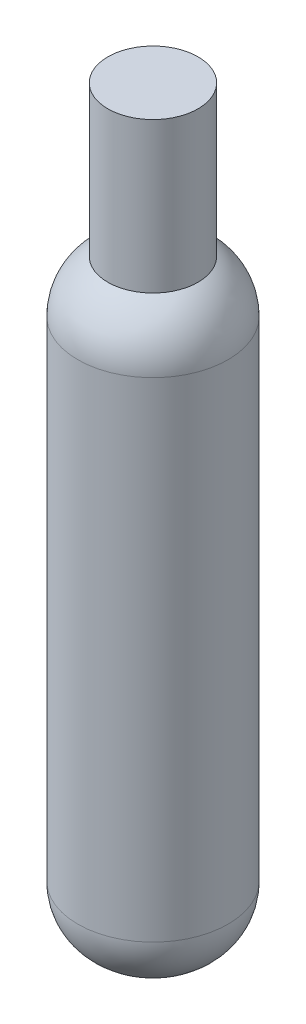
ISO-10303-21;
HEADER;
FILE_DESCRIPTION(('STEP AP214'),'2;1');
FILE_NAME('part.step','',(''),(''),'','','');
FILE_SCHEMA(('AUTOMOTIVE_DESIGN { 1 0 10303 214 1 1 1 1 }'));
ENDSEC;
DATA;
#1=APPLICATION_CONTEXT('core data for automotive mechanical design processes');
#2=APPLICATION_PROTOCOL_DEFINITION('international standard','automotive_design',2000,#1);
#3=PRODUCT_CONTEXT('',#1,'mechanical');
#4=PRODUCT('Part','Part','',(#3));
#5=PRODUCT_RELATED_PRODUCT_CATEGORY('part','',(#4));
#6=PRODUCT_DEFINITION_FORMATION('','',#4);
#7=PRODUCT_DEFINITION_CONTEXT('part definition',#1,'design');
#8=PRODUCT_DEFINITION('design','',#6,#7);
#9=PRODUCT_DEFINITION_SHAPE('','',#8);
#10=(LENGTH_UNIT() NAMED_UNIT(*) SI_UNIT(.MILLI.,.METRE.));
#11=(NAMED_UNIT(*) PLANE_ANGLE_UNIT() SI_UNIT($,.RADIAN.));
#12=(NAMED_UNIT(*) SI_UNIT($,.STERADIAN.) SOLID_ANGLE_UNIT());
#13=UNCERTAINTY_MEASURE_WITH_UNIT(LENGTH_MEASURE(1.E-05),#10,'distance_accuracy_value','');
#14=(GEOMETRIC_REPRESENTATION_CONTEXT(3) GLOBAL_UNCERTAINTY_ASSIGNED_CONTEXT((#13)) GLOBAL_UNIT_ASSIGNED_CONTEXT((#10,
#11,#12)) REPRESENTATION_CONTEXT('',''));
#15=CARTESIAN_POINT('',(0.,0.,0.));
#16=DIRECTION('',(0.,0.,1.));
#17=DIRECTION('',(1.,0.,0.));
#18=AXIS2_PLACEMENT_3D('',#15,#16,#17);
#19=CARTESIAN_POINT('',(0.,20.,0.));
#20=DIRECTION('',(0.,-1.,0.));
#21=DIRECTION('',(0.,0.,-1.));
#22=AXIS2_PLACEMENT_3D('',#19,#20,#21);
#23=CYLINDRICAL_SURFACE('',#22,2.5);
#24=CARTESIAN_POINT('',(0.,18.2679491924311,0.));
#25=DIRECTION('',(0.,1.,0.));
#26=DIRECTION('',(0.,0.,1.));
#27=AXIS2_PLACEMENT_3D('',#24,#25,#26);
#28=CIRCLE('',#27,2.5);
#29=CARTESIAN_POINT('',(0.,18.2679491924311,2.5));
#30=VERTEX_POINT('',#29);
#31=EDGE_CURVE('E10',#30,#30,#28,.F.);
#32=ORIENTED_EDGE('',*,*,#31,.T.);
#33=EDGE_LOOP('',(#32));
#34=FACE_BOUND('',#33,.T.);
#35=CARTESIAN_POINT('',(0.,2.,0.));
#36=DIRECTION('',(0.,1.,0.));
#37=DIRECTION('',(0.,0.,1.));
#38=AXIS2_PLACEMENT_3D('',#35,#36,#37);
#39=CIRCLE('',#38,2.5);
#40=CARTESIAN_POINT('',(0.,2.,2.5));
#41=VERTEX_POINT('',#40);
#42=EDGE_CURVE('E50',#41,#41,#39,.T.);
#43=ORIENTED_EDGE('',*,*,#42,.T.);
#44=EDGE_LOOP('',(#43));
#45=FACE_BOUND('',#44,.T.);
#46=ADVANCED_FACE('F37',(#34,#45),#23,.T.);
#47=CARTESIAN_POINT('',(0.,2.,0.));
#48=DIRECTION('',(0.,1.,0.));
#49=DIRECTION('',(0.,0.,1.));
#50=AXIS2_PLACEMENT_3D('',#47,#48,#49);
#51=DEGENERATE_TOROIDAL_SURFACE('',#50,0.5,2.,.T.);
#52=CARTESIAN_POINT('',(0.,0.267949192431121,0.));
#53=DIRECTION('',(0.,1.,0.));
#54=DIRECTION('',(0.,0.,1.));
#55=AXIS2_PLACEMENT_3D('',#52,#53,#54);
#56=CIRCLE('',#55,1.5);
#57=CARTESIAN_POINT('',(0.,0.267949192431121,1.5));
#58=VERTEX_POINT('',#57);
#59=EDGE_CURVE('E56',#58,#58,#56,.F.);
#60=ORIENTED_EDGE('',*,*,#59,.F.);
#61=EDGE_LOOP('',(#60));
#62=FACE_BOUND('',#61,.T.);
#63=ORIENTED_EDGE('',*,*,#42,.F.);
#64=EDGE_LOOP('',(#63));
#65=FACE_BOUND('',#64,.T.);
#66=ADVANCED_FACE('F71',(#62,#65),#51,.T.);
#67=CARTESIAN_POINT('',(0.,6.,0.));
#68=DIRECTION('',(0.,-1.,0.));
#69=DIRECTION('',(0.,0.,-1.));
#70=AXIS2_PLACEMENT_3D('',#67,#68,#69);
#71=CYLINDRICAL_SURFACE('',#70,1.5);
#72=ORIENTED_EDGE('',*,*,#59,.T.);
#73=EDGE_LOOP('',(#72));
#74=FACE_BOUND('',#73,.T.);
#75=CARTESIAN_POINT('',(0.,6.,0.));
#76=DIRECTION('',(0.,-1.,0.));
#77=DIRECTION('',(0.,0.,-1.));
#78=AXIS2_PLACEMENT_3D('',#75,#76,#77);
#79=CIRCLE('',#78,1.5);
#80=CARTESIAN_POINT('',(0.,6.,-1.5));
#81=VERTEX_POINT('',#80);
#82=EDGE_CURVE('E61',#81,#81,#79,.T.);
#83=ORIENTED_EDGE('',*,*,#82,.F.);
#84=EDGE_LOOP('',(#83));
#85=FACE_BOUND('',#84,.T.);
#86=ADVANCED_FACE('F68',(#74,#85),#71,.F.);
#87=CARTESIAN_POINT('',(0.,6.,0.));
#88=DIRECTION('',(0.,-1.,0.));
#89=DIRECTION('',(0.,0.,-1.));
#90=AXIS2_PLACEMENT_3D('',#87,#88,#89);
#91=PLANE('',#90);
#92=ORIENTED_EDGE('',*,*,#82,.T.);
#93=EDGE_LOOP('',(#92));
#94=FACE_BOUND('',#93,.T.);
#95=ADVANCED_FACE('F83',(#94),#91,.T.);
#96=CARTESIAN_POINT('',(0.,25.,0.));
#97=DIRECTION('',(0.,-1.,0.));
#98=DIRECTION('',(0.,0.,-1.));
#99=AXIS2_PLACEMENT_3D('',#96,#97,#98);
#100=CYLINDRICAL_SURFACE('',#99,1.5);
#101=CARTESIAN_POINT('',(0.,25.,0.));
#102=DIRECTION('',(0.,1.,0.));
#103=DIRECTION('',(0.,0.,1.));
#104=AXIS2_PLACEMENT_3D('',#101,#102,#103);
#105=CIRCLE('',#104,1.5);
#106=CARTESIAN_POINT('',(0.,25.,1.5));
#107=VERTEX_POINT('',#106);
#108=EDGE_CURVE('E60',#107,#107,#105,.T.);
#109=ORIENTED_EDGE('',*,*,#108,.F.);
#110=EDGE_LOOP('',(#109));
#111=FACE_BOUND('',#110,.T.);
#112=CARTESIAN_POINT('',(0.,20.,0.));
#113=DIRECTION('',(0.,1.,0.));
#114=DIRECTION('',(0.,0.,1.));
#115=AXIS2_PLACEMENT_3D('',#112,#113,#114);
#116=CIRCLE('',#115,1.5);
#117=CARTESIAN_POINT('',(0.,20.,1.5));
#118=VERTEX_POINT('',#117);
#119=EDGE_CURVE('E45',#118,#118,#116,.T.);
#120=ORIENTED_EDGE('',*,*,#119,.T.);
#121=EDGE_LOOP('',(#120));
#122=FACE_BOUND('',#121,.T.);
#123=ADVANCED_FACE('F86',(#111,#122),#100,.T.);
#124=CARTESIAN_POINT('',(0.,25.,0.));
#125=DIRECTION('',(0.,1.,0.));
#126=DIRECTION('',(0.,0.,1.));
#127=AXIS2_PLACEMENT_3D('',#124,#125,#126);
#128=PLANE('',#127);
#129=ORIENTED_EDGE('',*,*,#108,.T.);
#130=EDGE_LOOP('',(#129));
#131=FACE_BOUND('',#130,.T.);
#132=ADVANCED_FACE('F90',(#131),#128,.T.);
#133=CARTESIAN_POINT('',(0.,18.2679491924311,0.));
#134=DIRECTION('',(0.,1.,0.));
#135=DIRECTION('',(0.,0.,1.));
#136=AXIS2_PLACEMENT_3D('',#133,#134,#135);
#137=DEGENERATE_TOROIDAL_SURFACE('',#136,0.5,2.,.T.);
#138=ORIENTED_EDGE('',*,*,#31,.F.);
#139=EDGE_LOOP('',(#138));
#140=FACE_BOUND('',#139,.T.);
#141=ORIENTED_EDGE('',*,*,#119,.F.);
#142=EDGE_LOOP('',(#141));
#143=FACE_BOUND('',#142,.T.);
#144=ADVANCED_FACE('F39',(#140,#143),#137,.T.);
#145=CLOSED_SHELL('',(#46,#66,#86,#95,#123,#132,#144));
#146=MANIFOLD_SOLID_BREP('B2',#145);
#147=ADVANCED_BREP_SHAPE_REPRESENTATION('',(#18,#146),#14);
#148=SHAPE_DEFINITION_REPRESENTATION(#9,#147);
ENDSEC;
END-ISO-10303-21;
